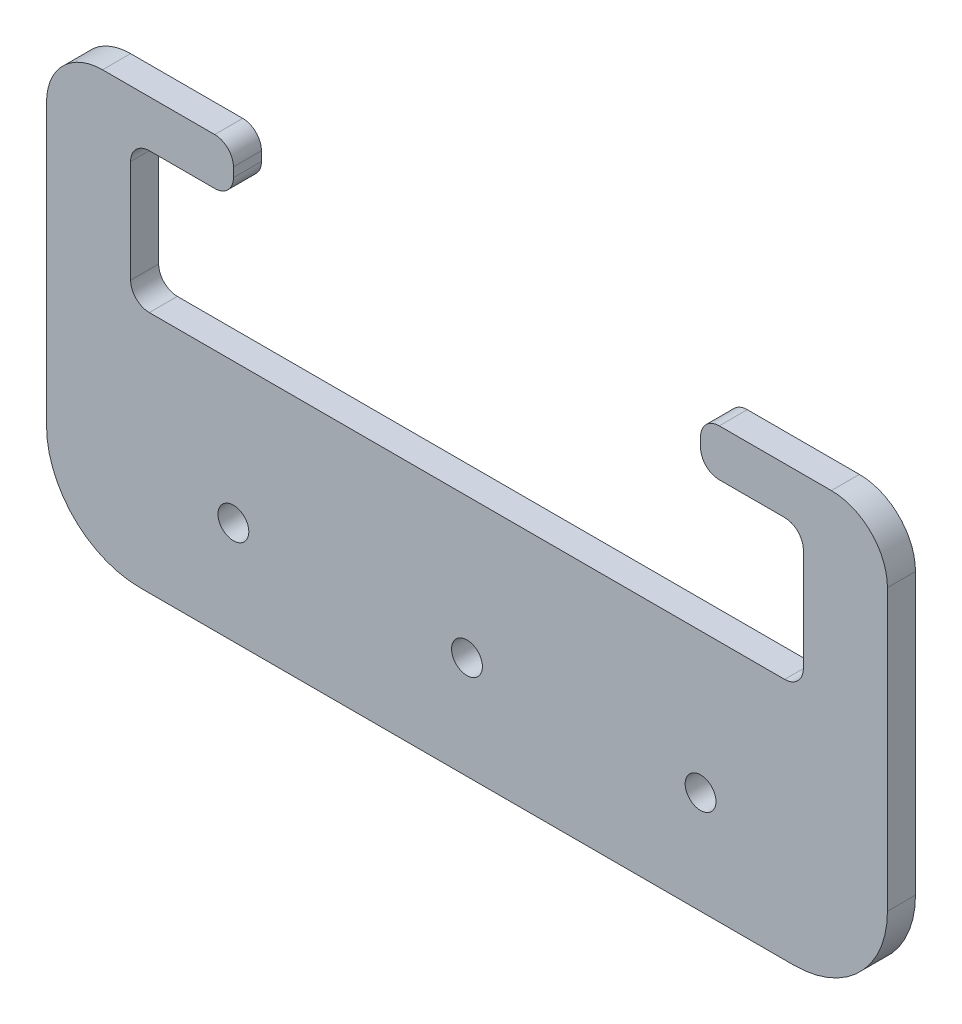
ISO-10303-21;
HEADER;
FILE_DESCRIPTION(('STEP AP214'),'2;1');
FILE_NAME('part.step','',(''),(''),'','','');
FILE_SCHEMA(('AUTOMOTIVE_DESIGN { 1 0 10303 214 1 1 1 1 }'));
ENDSEC;
DATA;
#1=APPLICATION_CONTEXT('core data for automotive mechanical design processes');
#2=APPLICATION_PROTOCOL_DEFINITION('international standard','automotive_design',2000,#1);
#3=PRODUCT_CONTEXT('',#1,'mechanical');
#4=PRODUCT('Part','Part','',(#3));
#5=PRODUCT_RELATED_PRODUCT_CATEGORY('part','',(#4));
#6=PRODUCT_DEFINITION_FORMATION('','',#4);
#7=PRODUCT_DEFINITION_CONTEXT('part definition',#1,'design');
#8=PRODUCT_DEFINITION('design','',#6,#7);
#9=PRODUCT_DEFINITION_SHAPE('','',#8);
#10=(LENGTH_UNIT() NAMED_UNIT(*) SI_UNIT(.MILLI.,.METRE.));
#11=(NAMED_UNIT(*) PLANE_ANGLE_UNIT() SI_UNIT($,.RADIAN.));
#12=(NAMED_UNIT(*) SI_UNIT($,.STERADIAN.) SOLID_ANGLE_UNIT());
#13=UNCERTAINTY_MEASURE_WITH_UNIT(LENGTH_MEASURE(1.E-05),#10,'distance_accuracy_value','');
#14=(GEOMETRIC_REPRESENTATION_CONTEXT(3) GLOBAL_UNCERTAINTY_ASSIGNED_CONTEXT((#13)) GLOBAL_UNIT_ASSIGNED_CONTEXT((#10,
#11,#12)) REPRESENTATION_CONTEXT('',''));
#15=CARTESIAN_POINT('',(0.,0.,0.));
#16=DIRECTION('',(0.,0.,1.));
#17=DIRECTION('',(1.,0.,0.));
#18=AXIS2_PLACEMENT_3D('',#15,#16,#17);
#19=CARTESIAN_POINT('',(45.,25.,3.));
#20=DIRECTION('',(-1.,0.,0.));
#21=DIRECTION('',(0.,0.,1.));
#22=AXIS2_PLACEMENT_3D('',#19,#20,#21);
#23=PLANE('',#22);
#24=DIRECTION('',(0.,1.,0.));
#25=VECTOR('',#24,1.);
#26=CARTESIAN_POINT('',(45.,25.,3.));
#27=LINE('',#26,#25);
#28=CARTESIAN_POINT('',(45.,-11.,3.));
#29=VERTEX_POINT('',#28);
#30=CARTESIAN_POINT('',(45.,19.,3.));
#31=VERTEX_POINT('',#30);
#32=EDGE_CURVE('E257',#29,#31,#27,.T.);
#33=ORIENTED_EDGE('',*,*,#32,.F.);
#34=DIRECTION('',(0.,0.,1.));
#35=VECTOR('',#34,1.);
#36=CARTESIAN_POINT('',(45.,-11.,3.));
#37=LINE('',#36,#35);
#38=CARTESIAN_POINT('',(45.,-11.,0.));
#39=VERTEX_POINT('',#38);
#40=EDGE_CURVE('E64',#29,#39,#37,.F.);
#41=ORIENTED_EDGE('',*,*,#40,.T.);
#42=DIRECTION('',(0.,1.,0.));
#43=VECTOR('',#42,1.);
#44=CARTESIAN_POINT('',(45.,25.,0.));
#45=LINE('',#44,#43);
#46=CARTESIAN_POINT('',(45.,19.,0.));
#47=VERTEX_POINT('',#46);
#48=EDGE_CURVE('E228',#39,#47,#45,.T.);
#49=ORIENTED_EDGE('',*,*,#48,.T.);
#50=DIRECTION('',(0.,0.,-1.));
#51=VECTOR('',#50,1.);
#52=CARTESIAN_POINT('',(45.,19.,3.));
#53=LINE('',#52,#51);
#54=EDGE_CURVE('E210',#47,#31,#53,.F.);
#55=ORIENTED_EDGE('',*,*,#54,.T.);
#56=EDGE_LOOP('',(#33,#41,#49,#55));
#57=FACE_BOUND('',#56,.T.);
#58=ADVANCED_FACE('F41',(#57),#23,.F.);
#59=CARTESIAN_POINT('',(25.,25.,3.));
#60=DIRECTION('',(0.,-1.,0.));
#61=DIRECTION('',(0.,0.,-1.));
#62=AXIS2_PLACEMENT_3D('',#59,#60,#61);
#63=PLANE('',#62);
#64=DIRECTION('',(-1.,0.,0.));
#65=VECTOR('',#64,1.);
#66=CARTESIAN_POINT('',(25.,25.,0.));
#67=LINE('',#66,#65);
#68=CARTESIAN_POINT('',(39.,25.,0.));
#69=VERTEX_POINT('',#68);
#70=CARTESIAN_POINT('',(27.,25.,0.));
#71=VERTEX_POINT('',#70);
#72=EDGE_CURVE('E218',#69,#71,#67,.T.);
#73=ORIENTED_EDGE('',*,*,#72,.T.);
#74=DIRECTION('',(0.,0.,-1.));
#75=VECTOR('',#74,1.);
#76=CARTESIAN_POINT('',(27.,25.,3.));
#77=LINE('',#76,#75);
#78=CARTESIAN_POINT('',(27.,25.,3.));
#79=VERTEX_POINT('',#78);
#80=EDGE_CURVE('E325',#71,#79,#77,.F.);
#81=ORIENTED_EDGE('',*,*,#80,.T.);
#82=DIRECTION('',(-1.,0.,0.));
#83=VECTOR('',#82,1.);
#84=CARTESIAN_POINT('',(25.,25.,3.));
#85=LINE('',#84,#83);
#86=CARTESIAN_POINT('',(39.,25.,3.));
#87=VERTEX_POINT('',#86);
#88=EDGE_CURVE('E221',#87,#79,#85,.T.);
#89=ORIENTED_EDGE('',*,*,#88,.F.);
#90=DIRECTION('',(0.,0.,-1.));
#91=VECTOR('',#90,1.);
#92=CARTESIAN_POINT('',(39.,25.,3.));
#93=LINE('',#92,#91);
#94=EDGE_CURVE('E208',#87,#69,#93,.T.);
#95=ORIENTED_EDGE('',*,*,#94,.T.);
#96=EDGE_LOOP('',(#73,#81,#89,#95));
#97=FACE_BOUND('',#96,.T.);
#98=ADVANCED_FACE('F217',(#97),#63,.F.);
#99=CARTESIAN_POINT('',(25.,25.,3.));
#100=DIRECTION('',(1.,0.,0.));
#101=DIRECTION('',(0.,0.,-1.));
#102=AXIS2_PLACEMENT_3D('',#99,#100,#101);
#103=PLANE('',#102);
#104=DIRECTION('',(0.,-1.,0.));
#105=VECTOR('',#104,1.);
#106=CARTESIAN_POINT('',(25.,25.,0.));
#107=LINE('',#106,#105);
#108=CARTESIAN_POINT('',(25.,23.,0.));
#109=VERTEX_POINT('',#108);
#110=CARTESIAN_POINT('',(25.,22.,0.));
#111=VERTEX_POINT('',#110);
#112=EDGE_CURVE('E227',#109,#111,#107,.T.);
#113=ORIENTED_EDGE('',*,*,#112,.T.);
#114=DIRECTION('',(0.,0.,-1.));
#115=VECTOR('',#114,1.);
#116=CARTESIAN_POINT('',(25.,22.,3.));
#117=LINE('',#116,#115);
#118=CARTESIAN_POINT('',(25.,22.,3.));
#119=VERTEX_POINT('',#118);
#120=EDGE_CURVE('E323',#111,#119,#117,.F.);
#121=ORIENTED_EDGE('',*,*,#120,.T.);
#122=DIRECTION('',(0.,-1.,0.));
#123=VECTOR('',#122,1.);
#124=CARTESIAN_POINT('',(25.,25.,3.));
#125=LINE('',#124,#123);
#126=CARTESIAN_POINT('',(25.,23.,3.));
#127=VERTEX_POINT('',#126);
#128=EDGE_CURVE('E381',#127,#119,#125,.T.);
#129=ORIENTED_EDGE('',*,*,#128,.F.);
#130=DIRECTION('',(0.,0.,-1.));
#131=VECTOR('',#130,1.);
#132=CARTESIAN_POINT('',(25.,23.,3.));
#133=LINE('',#132,#131);
#134=EDGE_CURVE('E320',#127,#109,#133,.T.);
#135=ORIENTED_EDGE('',*,*,#134,.T.);
#136=EDGE_LOOP('',(#113,#121,#129,#135));
#137=FACE_BOUND('',#136,.T.);
#138=ADVANCED_FACE('F483',(#137),#103,.F.);
#139=CARTESIAN_POINT('',(36.,20.,3.));
#140=DIRECTION('',(0.,1.,0.));
#141=DIRECTION('',(-1.,0.,0.));
#142=AXIS2_PLACEMENT_3D('',#139,#140,#141);
#143=PLANE('',#142);
#144=DIRECTION('',(1.,0.,0.));
#145=VECTOR('',#144,1.);
#146=CARTESIAN_POINT('',(36.,20.,0.));
#147=LINE('',#146,#145);
#148=CARTESIAN_POINT('',(27.,20.,0.));
#149=VERTEX_POINT('',#148);
#150=CARTESIAN_POINT('',(34.,20.,0.));
#151=VERTEX_POINT('',#150);
#152=EDGE_CURVE('E231',#149,#151,#147,.T.);
#153=ORIENTED_EDGE('',*,*,#152,.T.);
#154=DIRECTION('',(0.,0.,-1.));
#155=VECTOR('',#154,1.);
#156=CARTESIAN_POINT('',(34.,20.,3.));
#157=LINE('',#156,#155);
#158=CARTESIAN_POINT('',(34.,20.,3.));
#159=VERTEX_POINT('',#158);
#160=EDGE_CURVE('E280',#151,#159,#157,.F.);
#161=ORIENTED_EDGE('',*,*,#160,.T.);
#162=DIRECTION('',(1.,0.,0.));
#163=VECTOR('',#162,1.);
#164=CARTESIAN_POINT('',(36.,20.,3.));
#165=LINE('',#164,#163);
#166=CARTESIAN_POINT('',(27.,20.,3.));
#167=VERTEX_POINT('',#166);
#168=EDGE_CURVE('E388',#167,#159,#165,.T.);
#169=ORIENTED_EDGE('',*,*,#168,.F.);
#170=DIRECTION('',(0.,0.,-1.));
#171=VECTOR('',#170,1.);
#172=CARTESIAN_POINT('',(27.,20.,3.));
#173=LINE('',#172,#171);
#174=EDGE_CURVE('E277',#167,#149,#173,.T.);
#175=ORIENTED_EDGE('',*,*,#174,.T.);
#176=EDGE_LOOP('',(#153,#161,#169,#175));
#177=FACE_BOUND('',#176,.T.);
#178=ADVANCED_FACE('F475',(#177),#143,.F.);
#179=CARTESIAN_POINT('',(36.,20.,3.));
#180=DIRECTION('',(1.,0.,0.));
#181=DIRECTION('',(0.,0.,-1.));
#182=AXIS2_PLACEMENT_3D('',#179,#180,#181);
#183=PLANE('',#182);
#184=DIRECTION('',(0.,-1.,0.));
#185=VECTOR('',#184,1.);
#186=CARTESIAN_POINT('',(36.,20.,3.));
#187=LINE('',#186,#185);
#188=CARTESIAN_POINT('',(36.,18.,3.));
#189=VERTEX_POINT('',#188);
#190=CARTESIAN_POINT('',(36.,7.00000000000002,3.));
#191=VERTEX_POINT('',#190);
#192=EDGE_CURVE('E391',#189,#191,#187,.T.);
#193=ORIENTED_EDGE('',*,*,#192,.F.);
#194=DIRECTION('',(0.,0.,-1.));
#195=VECTOR('',#194,1.);
#196=CARTESIAN_POINT('',(36.,18.,0.));
#197=LINE('',#196,#195);
#198=CARTESIAN_POINT('',(36.,18.,0.));
#199=VERTEX_POINT('',#198);
#200=EDGE_CURVE('E274',#189,#199,#197,.T.);
#201=ORIENTED_EDGE('',*,*,#200,.T.);
#202=DIRECTION('',(0.,-1.,0.));
#203=VECTOR('',#202,1.);
#204=CARTESIAN_POINT('',(36.,20.,0.));
#205=LINE('',#204,#203);
#206=CARTESIAN_POINT('',(36.,7.00000000000002,0.));
#207=VERTEX_POINT('',#206);
#208=EDGE_CURVE('E239',#199,#207,#205,.T.);
#209=ORIENTED_EDGE('',*,*,#208,.T.);
#210=DIRECTION('',(0.,0.,-1.));
#211=VECTOR('',#210,1.);
#212=CARTESIAN_POINT('',(36.,7.00000000000002,3.));
#213=LINE('',#212,#211);
#214=EDGE_CURVE('E272',#207,#191,#213,.F.);
#215=ORIENTED_EDGE('',*,*,#214,.T.);
#216=EDGE_LOOP('',(#193,#201,#209,#215));
#217=FACE_BOUND('',#216,.T.);
#218=ADVANCED_FACE('F467',(#217),#183,.F.);
#219=CARTESIAN_POINT('',(36.,5.00000000000002,3.));
#220=DIRECTION('',(0.,-1.,0.));
#221=DIRECTION('',(1.,0.,0.));
#222=AXIS2_PLACEMENT_3D('',#219,#220,#221);
#223=PLANE('',#222);
#224=DIRECTION('',(-1.,0.,0.));
#225=VECTOR('',#224,1.);
#226=CARTESIAN_POINT('',(36.,5.00000000000002,3.));
#227=LINE('',#226,#225);
#228=CARTESIAN_POINT('',(34.,5.00000000000002,3.));
#229=VERTEX_POINT('',#228);
#230=CARTESIAN_POINT('',(-34.,5.00000000000001,3.));
#231=VERTEX_POINT('',#230);
#232=EDGE_CURVE('E394',#229,#231,#227,.T.);
#233=ORIENTED_EDGE('',*,*,#232,.F.);
#234=DIRECTION('',(0.,0.,-1.));
#235=VECTOR('',#234,1.);
#236=CARTESIAN_POINT('',(34.,5.00000000000002,0.));
#237=LINE('',#236,#235);
#238=CARTESIAN_POINT('',(34.,5.00000000000002,0.));
#239=VERTEX_POINT('',#238);
#240=EDGE_CURVE('E284',#229,#239,#237,.T.);
#241=ORIENTED_EDGE('',*,*,#240,.T.);
#242=DIRECTION('',(-1.,0.,0.));
#243=VECTOR('',#242,1.);
#244=CARTESIAN_POINT('',(36.,5.00000000000002,0.));
#245=LINE('',#244,#243);
#246=CARTESIAN_POINT('',(-34.,5.00000000000001,0.));
#247=VERTEX_POINT('',#246);
#248=EDGE_CURVE('E242',#239,#247,#245,.T.);
#249=ORIENTED_EDGE('',*,*,#248,.T.);
#250=DIRECTION('',(0.,0.,-1.));
#251=VECTOR('',#250,1.);
#252=CARTESIAN_POINT('',(-34.,5.00000000000001,3.));
#253=LINE('',#252,#251);
#254=EDGE_CURVE('E282',#247,#231,#253,.F.);
#255=ORIENTED_EDGE('',*,*,#254,.T.);
#256=EDGE_LOOP('',(#233,#241,#249,#255));
#257=FACE_BOUND('',#256,.T.);
#258=ADVANCED_FACE('F458',(#257),#223,.F.);
#259=CARTESIAN_POINT('',(-36.,20.,3.));
#260=DIRECTION('',(-1.,0.,0.));
#261=DIRECTION('',(0.,0.,1.));
#262=AXIS2_PLACEMENT_3D('',#259,#260,#261);
#263=PLANE('',#262);
#264=DIRECTION('',(0.,1.,0.));
#265=VECTOR('',#264,1.);
#266=CARTESIAN_POINT('',(-36.,20.,3.));
#267=LINE('',#266,#265);
#268=CARTESIAN_POINT('',(-36.,7.00000000000001,3.));
#269=VERTEX_POINT('',#268);
#270=CARTESIAN_POINT('',(-36.,18.,3.));
#271=VERTEX_POINT('',#270);
#272=EDGE_CURVE('E397',#269,#271,#267,.T.);
#273=ORIENTED_EDGE('',*,*,#272,.F.);
#274=DIRECTION('',(0.,0.,-1.));
#275=VECTOR('',#274,1.);
#276=CARTESIAN_POINT('',(-36.,7.00000000000001,0.));
#277=LINE('',#276,#275);
#278=CARTESIAN_POINT('',(-36.,7.00000000000001,0.));
#279=VERTEX_POINT('',#278);
#280=EDGE_CURVE('E289',#269,#279,#277,.T.);
#281=ORIENTED_EDGE('',*,*,#280,.T.);
#282=DIRECTION('',(0.,1.,0.));
#283=VECTOR('',#282,1.);
#284=CARTESIAN_POINT('',(-36.,20.,0.));
#285=LINE('',#284,#283);
#286=CARTESIAN_POINT('',(-36.,18.,0.));
#287=VERTEX_POINT('',#286);
#288=EDGE_CURVE('E245',#279,#287,#285,.T.);
#289=ORIENTED_EDGE('',*,*,#288,.T.);
#290=DIRECTION('',(0.,0.,-1.));
#291=VECTOR('',#290,1.);
#292=CARTESIAN_POINT('',(-36.,18.,3.));
#293=LINE('',#292,#291);
#294=EDGE_CURVE('E287',#287,#271,#293,.F.);
#295=ORIENTED_EDGE('',*,*,#294,.T.);
#296=EDGE_LOOP('',(#273,#281,#289,#295));
#297=FACE_BOUND('',#296,.T.);
#298=ADVANCED_FACE('F449',(#297),#263,.F.);
#299=CARTESIAN_POINT('',(-25.,20.,3.));
#300=DIRECTION('',(0.,1.,0.));
#301=DIRECTION('',(0.,0.,1.));
#302=AXIS2_PLACEMENT_3D('',#299,#300,#301);
#303=PLANE('',#302);
#304=DIRECTION('',(1.,0.,0.));
#305=VECTOR('',#304,1.);
#306=CARTESIAN_POINT('',(-25.,20.,3.));
#307=LINE('',#306,#305);
#308=CARTESIAN_POINT('',(-34.,20.,3.));
#309=VERTEX_POINT('',#308);
#310=CARTESIAN_POINT('',(-27.,20.,3.));
#311=VERTEX_POINT('',#310);
#312=EDGE_CURVE('E400',#309,#311,#307,.T.);
#313=ORIENTED_EDGE('',*,*,#312,.F.);
#314=DIRECTION('',(0.,0.,-1.));
#315=VECTOR('',#314,1.);
#316=CARTESIAN_POINT('',(-34.,20.,0.));
#317=LINE('',#316,#315);
#318=CARTESIAN_POINT('',(-34.,20.,0.));
#319=VERTEX_POINT('',#318);
#320=EDGE_CURVE('E294',#309,#319,#317,.T.);
#321=ORIENTED_EDGE('',*,*,#320,.T.);
#322=DIRECTION('',(1.,0.,0.));
#323=VECTOR('',#322,1.);
#324=CARTESIAN_POINT('',(-25.,20.,0.));
#325=LINE('',#324,#323);
#326=CARTESIAN_POINT('',(-27.,20.,0.));
#327=VERTEX_POINT('',#326);
#328=EDGE_CURVE('E248',#319,#327,#325,.T.);
#329=ORIENTED_EDGE('',*,*,#328,.T.);
#330=DIRECTION('',(0.,0.,-1.));
#331=VECTOR('',#330,1.);
#332=CARTESIAN_POINT('',(-27.,20.,3.));
#333=LINE('',#332,#331);
#334=EDGE_CURVE('E292',#327,#311,#333,.F.);
#335=ORIENTED_EDGE('',*,*,#334,.T.);
#336=EDGE_LOOP('',(#313,#321,#329,#335));
#337=FACE_BOUND('',#336,.T.);
#338=ADVANCED_FACE('F440',(#337),#303,.F.);
#339=CARTESIAN_POINT('',(-25.,25.,3.));
#340=DIRECTION('',(-1.,0.,0.));
#341=DIRECTION('',(0.,0.,1.));
#342=AXIS2_PLACEMENT_3D('',#339,#340,#341);
#343=PLANE('',#342);
#344=DIRECTION('',(0.,1.,0.));
#345=VECTOR('',#344,1.);
#346=CARTESIAN_POINT('',(-25.,25.,3.));
#347=LINE('',#346,#345);
#348=CARTESIAN_POINT('',(-25.,22.,3.));
#349=VERTEX_POINT('',#348);
#350=CARTESIAN_POINT('',(-25.,23.,3.));
#351=VERTEX_POINT('',#350);
#352=EDGE_CURVE('E403',#349,#351,#347,.T.);
#353=ORIENTED_EDGE('',*,*,#352,.F.);
#354=DIRECTION('',(0.,0.,-1.));
#355=VECTOR('',#354,1.);
#356=CARTESIAN_POINT('',(-25.,22.,3.));
#357=LINE('',#356,#355);
#358=CARTESIAN_POINT('',(-25.,22.,0.));
#359=VERTEX_POINT('',#358);
#360=EDGE_CURVE('E299',#349,#359,#357,.T.);
#361=ORIENTED_EDGE('',*,*,#360,.T.);
#362=DIRECTION('',(0.,1.,0.));
#363=VECTOR('',#362,1.);
#364=CARTESIAN_POINT('',(-25.,25.,0.));
#365=LINE('',#364,#363);
#366=CARTESIAN_POINT('',(-25.,23.,0.));
#367=VERTEX_POINT('',#366);
#368=EDGE_CURVE('E251',#359,#367,#365,.T.);
#369=ORIENTED_EDGE('',*,*,#368,.T.);
#370=DIRECTION('',(0.,0.,-1.));
#371=VECTOR('',#370,1.);
#372=CARTESIAN_POINT('',(-25.,23.,3.));
#373=LINE('',#372,#371);
#374=EDGE_CURVE('E297',#367,#351,#373,.F.);
#375=ORIENTED_EDGE('',*,*,#374,.T.);
#376=EDGE_LOOP('',(#353,#361,#369,#375));
#377=FACE_BOUND('',#376,.T.);
#378=ADVANCED_FACE('F431',(#377),#343,.F.);
#379=CARTESIAN_POINT('',(-45.,25.,3.));
#380=DIRECTION('',(0.,-1.,0.));
#381=DIRECTION('',(0.,0.,-1.));
#382=AXIS2_PLACEMENT_3D('',#379,#380,#381);
#383=PLANE('',#382);
#384=DIRECTION('',(-1.,0.,0.));
#385=VECTOR('',#384,1.);
#386=CARTESIAN_POINT('',(-45.,25.,3.));
#387=LINE('',#386,#385);
#388=CARTESIAN_POINT('',(-27.,25.,3.));
#389=VERTEX_POINT('',#388);
#390=CARTESIAN_POINT('',(-39.,25.,3.));
#391=VERTEX_POINT('',#390);
#392=EDGE_CURVE('E406',#389,#391,#387,.T.);
#393=ORIENTED_EDGE('',*,*,#392,.F.);
#394=DIRECTION('',(0.,0.,-1.));
#395=VECTOR('',#394,1.);
#396=CARTESIAN_POINT('',(-27.,25.,3.));
#397=LINE('',#396,#395);
#398=CARTESIAN_POINT('',(-27.,25.,0.));
#399=VERTEX_POINT('',#398);
#400=EDGE_CURVE('E317',#389,#399,#397,.T.);
#401=ORIENTED_EDGE('',*,*,#400,.T.);
#402=DIRECTION('',(-1.,0.,0.));
#403=VECTOR('',#402,1.);
#404=CARTESIAN_POINT('',(-45.,25.,0.));
#405=LINE('',#404,#403);
#406=CARTESIAN_POINT('',(-39.,25.,0.));
#407=VERTEX_POINT('',#406);
#408=EDGE_CURVE('E254',#399,#407,#405,.T.);
#409=ORIENTED_EDGE('',*,*,#408,.T.);
#410=DIRECTION('',(0.,0.,-1.));
#411=VECTOR('',#410,1.);
#412=CARTESIAN_POINT('',(-39.,25.,3.));
#413=LINE('',#412,#411);
#414=EDGE_CURVE('E269',#407,#391,#413,.F.);
#415=ORIENTED_EDGE('',*,*,#414,.T.);
#416=EDGE_LOOP('',(#393,#401,#409,#415));
#417=FACE_BOUND('',#416,.T.);
#418=ADVANCED_FACE('F422',(#417),#383,.F.);
#419=CARTESIAN_POINT('',(-45.,25.,3.));
#420=DIRECTION('',(1.,0.,0.));
#421=DIRECTION('',(0.,1.,0.));
#422=AXIS2_PLACEMENT_3D('',#419,#420,#421);
#423=PLANE('',#422);
#424=DIRECTION('',(0.,-1.,0.));
#425=VECTOR('',#424,1.);
#426=CARTESIAN_POINT('',(-45.,25.,0.));
#427=LINE('',#426,#425);
#428=CARTESIAN_POINT('',(-45.,19.,0.));
#429=VERTEX_POINT('',#428);
#430=CARTESIAN_POINT('',(-45.,-11.,0.));
#431=VERTEX_POINT('',#430);
#432=EDGE_CURVE('E256',#429,#431,#427,.T.);
#433=ORIENTED_EDGE('',*,*,#432,.T.);
#434=DIRECTION('',(0.,0.,-1.));
#435=VECTOR('',#434,1.);
#436=CARTESIAN_POINT('',(-45.,-11.,3.));
#437=LINE('',#436,#435);
#438=CARTESIAN_POINT('',(-45.,-11.,3.));
#439=VERTEX_POINT('',#438);
#440=EDGE_CURVE('E11',#431,#439,#437,.F.);
#441=ORIENTED_EDGE('',*,*,#440,.T.);
#442=DIRECTION('',(0.,-1.,0.));
#443=VECTOR('',#442,1.);
#444=CARTESIAN_POINT('',(-45.,25.,3.));
#445=LINE('',#444,#443);
#446=CARTESIAN_POINT('',(-45.,19.,3.));
#447=VERTEX_POINT('',#446);
#448=EDGE_CURVE('E222',#447,#439,#445,.T.);
#449=ORIENTED_EDGE('',*,*,#448,.F.);
#450=DIRECTION('',(0.,0.,-1.));
#451=VECTOR('',#450,1.);
#452=CARTESIAN_POINT('',(-45.,19.,3.));
#453=LINE('',#452,#451);
#454=EDGE_CURVE('E266',#447,#429,#453,.T.);
#455=ORIENTED_EDGE('',*,*,#454,.T.);
#456=EDGE_LOOP('',(#433,#441,#449,#455));
#457=FACE_BOUND('',#456,.T.);
#458=ADVANCED_FACE('F415',(#457),#423,.F.);
#459=CARTESIAN_POINT('',(0.,0.,3.));
#460=DIRECTION('',(0.,0.,1.));
#461=DIRECTION('',(1.,0.,0.));
#462=AXIS2_PLACEMENT_3D('',#459,#460,#461);
#463=PLANE('',#462);
#464=DIRECTION('',(-1.,0.,0.));
#465=VECTOR('',#464,1.);
#466=CARTESIAN_POINT('',(-45.,-21.,3.));
#467=LINE('',#466,#465);
#468=CARTESIAN_POINT('',(35.,-21.,3.));
#469=VERTEX_POINT('',#468);
#470=CARTESIAN_POINT('',(-35.,-21.,3.));
#471=VERTEX_POINT('',#470);
#472=EDGE_CURVE('E374',#469,#471,#467,.T.);
#473=ORIENTED_EDGE('',*,*,#472,.F.);
#474=CARTESIAN_POINT('',(35.,-11.,3.));
#475=DIRECTION('',(0.,0.,1.));
#476=DIRECTION('',(1.,0.,0.));
#477=AXIS2_PLACEMENT_3D('',#474,#475,#476);
#478=CIRCLE('',#477,10.);
#479=EDGE_CURVE('E360',#469,#29,#478,.T.);
#480=ORIENTED_EDGE('',*,*,#479,.T.);
#481=ORIENTED_EDGE('',*,*,#32,.T.);
#482=CARTESIAN_POINT('',(39.,19.,3.));
#483=DIRECTION('',(0.,0.,1.));
#484=DIRECTION('',(1.,0.,0.));
#485=AXIS2_PLACEMENT_3D('',#482,#483,#484);
#486=CIRCLE('',#485,6.);
#487=EDGE_CURVE('E264',#31,#87,#486,.T.);
#488=ORIENTED_EDGE('',*,*,#487,.T.);
#489=ORIENTED_EDGE('',*,*,#88,.T.);
#490=CARTESIAN_POINT('',(27.,23.,3.));
#491=DIRECTION('',(0.,0.,1.));
#492=DIRECTION('',(1.,0.,0.));
#493=AXIS2_PLACEMENT_3D('',#490,#491,#492);
#494=CIRCLE('',#493,2.);
#495=EDGE_CURVE('E309',#79,#127,#494,.T.);
#496=ORIENTED_EDGE('',*,*,#495,.T.);
#497=ORIENTED_EDGE('',*,*,#128,.T.);
#498=CARTESIAN_POINT('',(27.,22.,3.));
#499=DIRECTION('',(0.,0.,1.));
#500=DIRECTION('',(1.,0.,0.));
#501=AXIS2_PLACEMENT_3D('',#498,#499,#500);
#502=CIRCLE('',#501,2.);
#503=EDGE_CURVE('E311',#119,#167,#502,.T.);
#504=ORIENTED_EDGE('',*,*,#503,.T.);
#505=ORIENTED_EDGE('',*,*,#168,.T.);
#506=CARTESIAN_POINT('',(34.,18.,3.));
#507=DIRECTION('',(0.,0.,1.));
#508=DIRECTION('',(1.,0.,0.));
#509=AXIS2_PLACEMENT_3D('',#506,#507,#508);
#510=CIRCLE('',#509,2.);
#511=EDGE_CURVE('E329',#159,#189,#510,.F.);
#512=ORIENTED_EDGE('',*,*,#511,.T.);
#513=ORIENTED_EDGE('',*,*,#192,.T.);
#514=CARTESIAN_POINT('',(34.,7.00000000000002,3.));
#515=DIRECTION('',(0.,0.,1.));
#516=DIRECTION('',(1.,0.,0.));
#517=AXIS2_PLACEMENT_3D('',#514,#515,#516);
#518=CIRCLE('',#517,2.);
#519=EDGE_CURVE('E333',#191,#229,#518,.F.);
#520=ORIENTED_EDGE('',*,*,#519,.T.);
#521=ORIENTED_EDGE('',*,*,#232,.T.);
#522=CARTESIAN_POINT('',(-34.,7.00000000000001,3.));
#523=DIRECTION('',(0.,0.,1.));
#524=DIRECTION('',(1.,0.,0.));
#525=AXIS2_PLACEMENT_3D('',#522,#523,#524);
#526=CIRCLE('',#525,2.);
#527=EDGE_CURVE('E337',#231,#269,#526,.F.);
#528=ORIENTED_EDGE('',*,*,#527,.T.);
#529=ORIENTED_EDGE('',*,*,#272,.T.);
#530=CARTESIAN_POINT('',(-34.,18.,3.));
#531=DIRECTION('',(0.,0.,1.));
#532=DIRECTION('',(1.,0.,0.));
#533=AXIS2_PLACEMENT_3D('',#530,#531,#532);
#534=CIRCLE('',#533,2.);
#535=EDGE_CURVE('E341',#271,#309,#534,.F.);
#536=ORIENTED_EDGE('',*,*,#535,.T.);
#537=ORIENTED_EDGE('',*,*,#312,.T.);
#538=CARTESIAN_POINT('',(-27.,22.,3.));
#539=DIRECTION('',(0.,0.,1.));
#540=DIRECTION('',(1.,0.,0.));
#541=AXIS2_PLACEMENT_3D('',#538,#539,#540);
#542=CIRCLE('',#541,2.);
#543=EDGE_CURVE('E315',#311,#349,#542,.T.);
#544=ORIENTED_EDGE('',*,*,#543,.T.);
#545=ORIENTED_EDGE('',*,*,#352,.T.);
#546=CARTESIAN_POINT('',(-27.,23.,3.));
#547=DIRECTION('',(0.,0.,1.));
#548=DIRECTION('',(1.,0.,0.));
#549=AXIS2_PLACEMENT_3D('',#546,#547,#548);
#550=CIRCLE('',#549,2.);
#551=EDGE_CURVE('E313',#351,#389,#550,.T.);
#552=ORIENTED_EDGE('',*,*,#551,.T.);
#553=ORIENTED_EDGE('',*,*,#392,.T.);
#554=CARTESIAN_POINT('',(-39.,19.,3.));
#555=DIRECTION('',(0.,0.,1.));
#556=DIRECTION('',(1.,0.,0.));
#557=AXIS2_PLACEMENT_3D('',#554,#555,#556);
#558=CIRCLE('',#557,6.);
#559=EDGE_CURVE('E262',#391,#447,#558,.T.);
#560=ORIENTED_EDGE('',*,*,#559,.T.);
#561=ORIENTED_EDGE('',*,*,#448,.T.);
#562=CARTESIAN_POINT('',(-35.,-11.,3.));
#563=DIRECTION('',(0.,0.,1.));
#564=DIRECTION('',(1.,0.,0.));
#565=AXIS2_PLACEMENT_3D('',#562,#563,#564);
#566=CIRCLE('',#565,10.);
#567=EDGE_CURVE('E358',#439,#471,#566,.T.);
#568=ORIENTED_EDGE('',*,*,#567,.T.);
#569=EDGE_LOOP('',(#473,#480,#481,#488,#489,#496,#497,#504,#505,#512,#513,#520,#521,#528,#529,
#536,#537,#544,#545,#552,#553,#560,#561,#568));
#570=FACE_BOUND('',#569,.T.);
#571=CARTESIAN_POINT('',(-25.,-10.,3.));
#572=DIRECTION('',(0.,0.,1.));
#573=DIRECTION('',(1.,0.,0.));
#574=AXIS2_PLACEMENT_3D('',#571,#572,#573);
#575=CIRCLE('',#574,1.65);
#576=CARTESIAN_POINT('',(-23.35,-10.,3.));
#577=VERTEX_POINT('',#576);
#578=EDGE_CURVE('E348',#577,#577,#575,.T.);
#579=ORIENTED_EDGE('',*,*,#578,.F.);
#580=EDGE_LOOP('',(#579));
#581=FACE_BOUND('',#580,.T.);
#582=CARTESIAN_POINT('',(25.,-10.,3.));
#583=DIRECTION('',(0.,0.,1.));
#584=DIRECTION('',(1.,0.,0.));
#585=AXIS2_PLACEMENT_3D('',#582,#583,#584);
#586=CIRCLE('',#585,1.65);
#587=CARTESIAN_POINT('',(26.65,-10.,3.));
#588=VERTEX_POINT('',#587);
#589=EDGE_CURVE('E736',#588,#588,#586,.T.);
#590=ORIENTED_EDGE('',*,*,#589,.F.);
#591=EDGE_LOOP('',(#590));
#592=FACE_BOUND('',#591,.T.);
#593=CARTESIAN_POINT('',(0.,-10.,3.));
#594=DIRECTION('',(0.,0.,1.));
#595=DIRECTION('',(1.,0.,0.));
#596=AXIS2_PLACEMENT_3D('',#593,#594,#595);
#597=CIRCLE('',#596,1.65);
#598=CARTESIAN_POINT('',(1.65,-10.,3.));
#599=VERTEX_POINT('',#598);
#600=EDGE_CURVE('E373',#599,#599,#597,.T.);
#601=ORIENTED_EDGE('',*,*,#600,.F.);
#602=EDGE_LOOP('',(#601));
#603=FACE_BOUND('',#602,.T.);
#604=ADVANCED_FACE('F378',(#570,#581,#592,#603),#463,.T.);
#605=CARTESIAN_POINT('',(0.,0.,0.));
#606=DIRECTION('',(0.,0.,1.));
#607=DIRECTION('',(1.,0.,0.));
#608=AXIS2_PLACEMENT_3D('',#605,#606,#607);
#609=PLANE('',#608);
#610=CARTESIAN_POINT('',(-25.,-10.,0.));
#611=DIRECTION('',(0.,0.,1.));
#612=DIRECTION('',(1.,0.,0.));
#613=AXIS2_PLACEMENT_3D('',#610,#611,#612);
#614=CIRCLE('',#613,1.65);
#615=CARTESIAN_POINT('',(-23.35,-10.,0.));
#616=VERTEX_POINT('',#615);
#617=EDGE_CURVE('E233',#616,#616,#614,.T.);
#618=ORIENTED_EDGE('',*,*,#617,.T.);
#619=EDGE_LOOP('',(#618));
#620=FACE_BOUND('',#619,.T.);
#621=CARTESIAN_POINT('',(25.,-10.,0.));
#622=DIRECTION('',(0.,0.,1.));
#623=DIRECTION('',(1.,0.,0.));
#624=AXIS2_PLACEMENT_3D('',#621,#622,#623);
#625=CIRCLE('',#624,1.65);
#626=CARTESIAN_POINT('',(26.65,-10.,0.));
#627=VERTEX_POINT('',#626);
#628=EDGE_CURVE('E347',#627,#627,#625,.T.);
#629=ORIENTED_EDGE('',*,*,#628,.T.);
#630=EDGE_LOOP('',(#629));
#631=FACE_BOUND('',#630,.T.);
#632=CARTESIAN_POINT('',(0.,-10.,0.));
#633=DIRECTION('',(0.,0.,1.));
#634=DIRECTION('',(1.,0.,0.));
#635=AXIS2_PLACEMENT_3D('',#632,#633,#634);
#636=CIRCLE('',#635,1.65);
#637=CARTESIAN_POINT('',(1.65,-10.,0.));
#638=VERTEX_POINT('',#637);
#639=EDGE_CURVE('E344',#638,#638,#636,.T.);
#640=ORIENTED_EDGE('',*,*,#639,.T.);
#641=EDGE_LOOP('',(#640));
#642=FACE_BOUND('',#641,.T.);
#643=ORIENTED_EDGE('',*,*,#48,.F.);
#644=CARTESIAN_POINT('',(35.,-11.,0.));
#645=DIRECTION('',(0.,0.,1.));
#646=DIRECTION('',(1.,0.,0.));
#647=AXIS2_PLACEMENT_3D('',#644,#645,#646);
#648=CIRCLE('',#647,10.);
#649=CARTESIAN_POINT('',(35.,-21.,0.));
#650=VERTEX_POINT('',#649);
#651=EDGE_CURVE('E49',#39,#650,#648,.F.);
#652=ORIENTED_EDGE('',*,*,#651,.T.);
#653=DIRECTION('',(-1.,0.,0.));
#654=VECTOR('',#653,1.);
#655=CARTESIAN_POINT('',(0.,-21.,0.));
#656=LINE('',#655,#654);
#657=CARTESIAN_POINT('',(-35.,-21.,0.));
#658=VERTEX_POINT('',#657);
#659=EDGE_CURVE('E365',#650,#658,#656,.T.);
#660=ORIENTED_EDGE('',*,*,#659,.T.);
#661=CARTESIAN_POINT('',(-35.,-11.,0.));
#662=DIRECTION('',(0.,0.,1.));
#663=DIRECTION('',(1.,0.,0.));
#664=AXIS2_PLACEMENT_3D('',#661,#662,#663);
#665=CIRCLE('',#664,10.);
#666=EDGE_CURVE('E56',#658,#431,#665,.F.);
#667=ORIENTED_EDGE('',*,*,#666,.T.);
#668=ORIENTED_EDGE('',*,*,#432,.F.);
#669=CARTESIAN_POINT('',(-39.,19.,0.));
#670=DIRECTION('',(0.,0.,1.));
#671=DIRECTION('',(1.,0.,0.));
#672=AXIS2_PLACEMENT_3D('',#669,#670,#671);
#673=CIRCLE('',#672,6.);
#674=EDGE_CURVE('E212',#429,#407,#673,.F.);
#675=ORIENTED_EDGE('',*,*,#674,.T.);
#676=ORIENTED_EDGE('',*,*,#408,.F.);
#677=CARTESIAN_POINT('',(-27.,23.,0.));
#678=DIRECTION('',(0.,0.,1.));
#679=DIRECTION('',(1.,0.,0.));
#680=AXIS2_PLACEMENT_3D('',#677,#678,#679);
#681=CIRCLE('',#680,2.);
#682=EDGE_CURVE('E305',#399,#367,#681,.F.);
#683=ORIENTED_EDGE('',*,*,#682,.T.);
#684=ORIENTED_EDGE('',*,*,#368,.F.);
#685=CARTESIAN_POINT('',(-27.,22.,0.));
#686=DIRECTION('',(0.,0.,1.));
#687=DIRECTION('',(1.,0.,0.));
#688=AXIS2_PLACEMENT_3D('',#685,#686,#687);
#689=CIRCLE('',#688,2.);
#690=EDGE_CURVE('E307',#359,#327,#689,.F.);
#691=ORIENTED_EDGE('',*,*,#690,.T.);
#692=ORIENTED_EDGE('',*,*,#328,.F.);
#693=CARTESIAN_POINT('',(-34.,18.,0.));
#694=DIRECTION('',(0.,0.,1.));
#695=DIRECTION('',(1.,0.,0.));
#696=AXIS2_PLACEMENT_3D('',#693,#694,#695);
#697=CIRCLE('',#696,2.);
#698=EDGE_CURVE('E339',#319,#287,#697,.T.);
#699=ORIENTED_EDGE('',*,*,#698,.T.);
#700=ORIENTED_EDGE('',*,*,#288,.F.);
#701=CARTESIAN_POINT('',(-34.,7.00000000000001,0.));
#702=DIRECTION('',(0.,0.,1.));
#703=DIRECTION('',(1.,0.,0.));
#704=AXIS2_PLACEMENT_3D('',#701,#702,#703);
#705=CIRCLE('',#704,2.);
#706=EDGE_CURVE('E335',#279,#247,#705,.T.);
#707=ORIENTED_EDGE('',*,*,#706,.T.);
#708=ORIENTED_EDGE('',*,*,#248,.F.);
#709=CARTESIAN_POINT('',(34.,7.00000000000002,0.));
#710=DIRECTION('',(0.,0.,1.));
#711=DIRECTION('',(1.,0.,0.));
#712=AXIS2_PLACEMENT_3D('',#709,#710,#711);
#713=CIRCLE('',#712,2.);
#714=EDGE_CURVE('E331',#239,#207,#713,.T.);
#715=ORIENTED_EDGE('',*,*,#714,.T.);
#716=ORIENTED_EDGE('',*,*,#208,.F.);
#717=CARTESIAN_POINT('',(34.,18.,0.));
#718=DIRECTION('',(0.,0.,1.));
#719=DIRECTION('',(1.,0.,0.));
#720=AXIS2_PLACEMENT_3D('',#717,#718,#719);
#721=CIRCLE('',#720,2.);
#722=EDGE_CURVE('E327',#199,#151,#721,.T.);
#723=ORIENTED_EDGE('',*,*,#722,.T.);
#724=ORIENTED_EDGE('',*,*,#152,.F.);
#725=CARTESIAN_POINT('',(27.,22.,0.));
#726=DIRECTION('',(0.,0.,1.));
#727=DIRECTION('',(1.,0.,0.));
#728=AXIS2_PLACEMENT_3D('',#725,#726,#727);
#729=CIRCLE('',#728,2.);
#730=EDGE_CURVE('E303',#149,#111,#729,.F.);
#731=ORIENTED_EDGE('',*,*,#730,.T.);
#732=ORIENTED_EDGE('',*,*,#112,.F.);
#733=CARTESIAN_POINT('',(27.,23.,0.));
#734=DIRECTION('',(0.,0.,1.));
#735=DIRECTION('',(1.,0.,0.));
#736=AXIS2_PLACEMENT_3D('',#733,#734,#735);
#737=CIRCLE('',#736,2.);
#738=EDGE_CURVE('E226',#109,#71,#737,.F.);
#739=ORIENTED_EDGE('',*,*,#738,.T.);
#740=ORIENTED_EDGE('',*,*,#72,.F.);
#741=CARTESIAN_POINT('',(39.,19.,0.));
#742=DIRECTION('',(0.,0.,1.));
#743=DIRECTION('',(1.,0.,0.));
#744=AXIS2_PLACEMENT_3D('',#741,#742,#743);
#745=CIRCLE('',#744,6.);
#746=EDGE_CURVE('E204',#69,#47,#745,.F.);
#747=ORIENTED_EDGE('',*,*,#746,.T.);
#748=EDGE_LOOP('',(#643,#652,#660,#667,#668,#675,#676,#683,#684,#691,#692,#699,#700,#707,#708,
#715,#716,#723,#724,#731,#732,#739,#740,#747));
#749=FACE_BOUND('',#748,.T.);
#750=ADVANCED_FACE('F224',(#620,#631,#642,#749),#609,.F.);
#751=CARTESIAN_POINT('',(39.,19.,3.));
#752=DIRECTION('',(0.,0.,-1.));
#753=DIRECTION('',(-1.,0.,0.));
#754=AXIS2_PLACEMENT_3D('',#751,#752,#753);
#755=CYLINDRICAL_SURFACE('',#754,6.);
#756=ORIENTED_EDGE('',*,*,#487,.F.);
#757=ORIENTED_EDGE('',*,*,#54,.F.);
#758=ORIENTED_EDGE('',*,*,#746,.F.);
#759=ORIENTED_EDGE('',*,*,#94,.F.);
#760=EDGE_LOOP('',(#756,#757,#758,#759));
#761=FACE_BOUND('',#760,.T.);
#762=ADVANCED_FACE('F207',(#761),#755,.T.);
#763=CARTESIAN_POINT('',(-39.,19.,3.));
#764=DIRECTION('',(0.,0.,-1.));
#765=DIRECTION('',(-1.,0.,0.));
#766=AXIS2_PLACEMENT_3D('',#763,#764,#765);
#767=CYLINDRICAL_SURFACE('',#766,6.);
#768=ORIENTED_EDGE('',*,*,#559,.F.);
#769=ORIENTED_EDGE('',*,*,#414,.F.);
#770=ORIENTED_EDGE('',*,*,#674,.F.);
#771=ORIENTED_EDGE('',*,*,#454,.F.);
#772=EDGE_LOOP('',(#768,#769,#770,#771));
#773=FACE_BOUND('',#772,.T.);
#774=ADVANCED_FACE('F419',(#773),#767,.T.);
#775=CARTESIAN_POINT('',(34.,18.,3.));
#776=DIRECTION('',(0.,0.,1.));
#777=DIRECTION('',(1.,0.,0.));
#778=AXIS2_PLACEMENT_3D('',#775,#776,#777);
#779=CYLINDRICAL_SURFACE('',#778,2.);
#780=ORIENTED_EDGE('',*,*,#511,.F.);
#781=ORIENTED_EDGE('',*,*,#160,.F.);
#782=ORIENTED_EDGE('',*,*,#722,.F.);
#783=ORIENTED_EDGE('',*,*,#200,.F.);
#784=EDGE_LOOP('',(#780,#781,#782,#783));
#785=FACE_BOUND('',#784,.T.);
#786=ADVANCED_FACE('F471',(#785),#779,.F.);
#787=CARTESIAN_POINT('',(34.,7.00000000000002,3.));
#788=DIRECTION('',(0.,0.,1.));
#789=DIRECTION('',(1.,0.,0.));
#790=AXIS2_PLACEMENT_3D('',#787,#788,#789);
#791=CYLINDRICAL_SURFACE('',#790,2.);
#792=ORIENTED_EDGE('',*,*,#519,.F.);
#793=ORIENTED_EDGE('',*,*,#214,.F.);
#794=ORIENTED_EDGE('',*,*,#714,.F.);
#795=ORIENTED_EDGE('',*,*,#240,.F.);
#796=EDGE_LOOP('',(#792,#793,#794,#795));
#797=FACE_BOUND('',#796,.T.);
#798=ADVANCED_FACE('F462',(#797),#791,.F.);
#799=CARTESIAN_POINT('',(-34.,7.00000000000001,3.));
#800=DIRECTION('',(0.,0.,1.));
#801=DIRECTION('',(1.,0.,0.));
#802=AXIS2_PLACEMENT_3D('',#799,#800,#801);
#803=CYLINDRICAL_SURFACE('',#802,2.);
#804=ORIENTED_EDGE('',*,*,#527,.F.);
#805=ORIENTED_EDGE('',*,*,#254,.F.);
#806=ORIENTED_EDGE('',*,*,#706,.F.);
#807=ORIENTED_EDGE('',*,*,#280,.F.);
#808=EDGE_LOOP('',(#804,#805,#806,#807));
#809=FACE_BOUND('',#808,.T.);
#810=ADVANCED_FACE('F453',(#809),#803,.F.);
#811=CARTESIAN_POINT('',(-34.,18.,3.));
#812=DIRECTION('',(0.,0.,1.));
#813=DIRECTION('',(1.,0.,0.));
#814=AXIS2_PLACEMENT_3D('',#811,#812,#813);
#815=CYLINDRICAL_SURFACE('',#814,2.);
#816=ORIENTED_EDGE('',*,*,#535,.F.);
#817=ORIENTED_EDGE('',*,*,#294,.F.);
#818=ORIENTED_EDGE('',*,*,#698,.F.);
#819=ORIENTED_EDGE('',*,*,#320,.F.);
#820=EDGE_LOOP('',(#816,#817,#818,#819));
#821=FACE_BOUND('',#820,.T.);
#822=ADVANCED_FACE('F444',(#821),#815,.F.);
#823=CARTESIAN_POINT('',(-27.,22.,3.));
#824=DIRECTION('',(0.,0.,-1.));
#825=DIRECTION('',(-1.,0.,0.));
#826=AXIS2_PLACEMENT_3D('',#823,#824,#825);
#827=CYLINDRICAL_SURFACE('',#826,2.);
#828=ORIENTED_EDGE('',*,*,#543,.F.);
#829=ORIENTED_EDGE('',*,*,#334,.F.);
#830=ORIENTED_EDGE('',*,*,#690,.F.);
#831=ORIENTED_EDGE('',*,*,#360,.F.);
#832=EDGE_LOOP('',(#828,#829,#830,#831));
#833=FACE_BOUND('',#832,.T.);
#834=ADVANCED_FACE('F435',(#833),#827,.T.);
#835=CARTESIAN_POINT('',(-27.,23.,3.));
#836=DIRECTION('',(0.,0.,-1.));
#837=DIRECTION('',(-1.,0.,0.));
#838=AXIS2_PLACEMENT_3D('',#835,#836,#837);
#839=CYLINDRICAL_SURFACE('',#838,2.);
#840=ORIENTED_EDGE('',*,*,#551,.F.);
#841=ORIENTED_EDGE('',*,*,#374,.F.);
#842=ORIENTED_EDGE('',*,*,#682,.F.);
#843=ORIENTED_EDGE('',*,*,#400,.F.);
#844=EDGE_LOOP('',(#840,#841,#842,#843));
#845=FACE_BOUND('',#844,.T.);
#846=ADVANCED_FACE('F426',(#845),#839,.T.);
#847=CARTESIAN_POINT('',(27.,22.,3.));
#848=DIRECTION('',(0.,0.,-1.));
#849=DIRECTION('',(-1.,0.,0.));
#850=AXIS2_PLACEMENT_3D('',#847,#848,#849);
#851=CYLINDRICAL_SURFACE('',#850,2.);
#852=ORIENTED_EDGE('',*,*,#503,.F.);
#853=ORIENTED_EDGE('',*,*,#120,.F.);
#854=ORIENTED_EDGE('',*,*,#730,.F.);
#855=ORIENTED_EDGE('',*,*,#174,.F.);
#856=EDGE_LOOP('',(#852,#853,#854,#855));
#857=FACE_BOUND('',#856,.T.);
#858=ADVANCED_FACE('F480',(#857),#851,.T.);
#859=CARTESIAN_POINT('',(27.,23.,3.));
#860=DIRECTION('',(0.,0.,-1.));
#861=DIRECTION('',(-1.,0.,0.));
#862=AXIS2_PLACEMENT_3D('',#859,#860,#861);
#863=CYLINDRICAL_SURFACE('',#862,2.);
#864=ORIENTED_EDGE('',*,*,#495,.F.);
#865=ORIENTED_EDGE('',*,*,#80,.F.);
#866=ORIENTED_EDGE('',*,*,#738,.F.);
#867=ORIENTED_EDGE('',*,*,#134,.F.);
#868=EDGE_LOOP('',(#864,#865,#866,#867));
#869=FACE_BOUND('',#868,.T.);
#870=ADVANCED_FACE('F488',(#869),#863,.T.);
#871=CARTESIAN_POINT('',(0.,-10.,-2.));
#872=DIRECTION('',(0.,0.,1.));
#873=DIRECTION('',(1.,0.,0.));
#874=AXIS2_PLACEMENT_3D('',#871,#872,#873);
#875=CYLINDRICAL_SURFACE('',#874,1.65);
#876=ORIENTED_EDGE('',*,*,#600,.T.);
#877=EDGE_LOOP('',(#876));
#878=FACE_BOUND('',#877,.T.);
#879=ORIENTED_EDGE('',*,*,#639,.F.);
#880=EDGE_LOOP('',(#879));
#881=FACE_BOUND('',#880,.T.);
#882=ADVANCED_FACE('F490',(#878,#881),#875,.F.);
#883=CARTESIAN_POINT('',(25.,-10.,-2.));
#884=DIRECTION('',(0.,0.,1.));
#885=DIRECTION('',(1.,0.,0.));
#886=AXIS2_PLACEMENT_3D('',#883,#884,#885);
#887=CYLINDRICAL_SURFACE('',#886,1.65);
#888=ORIENTED_EDGE('',*,*,#589,.T.);
#889=EDGE_LOOP('',(#888));
#890=FACE_BOUND('',#889,.T.);
#891=ORIENTED_EDGE('',*,*,#628,.F.);
#892=EDGE_LOOP('',(#891));
#893=FACE_BOUND('',#892,.T.);
#894=ADVANCED_FACE('F496',(#890,#893),#887,.F.);
#895=CARTESIAN_POINT('',(-25.,-10.,-2.));
#896=DIRECTION('',(0.,0.,1.));
#897=DIRECTION('',(1.,0.,0.));
#898=AXIS2_PLACEMENT_3D('',#895,#896,#897);
#899=CYLINDRICAL_SURFACE('',#898,1.65);
#900=ORIENTED_EDGE('',*,*,#578,.T.);
#901=EDGE_LOOP('',(#900));
#902=FACE_BOUND('',#901,.T.);
#903=ORIENTED_EDGE('',*,*,#617,.F.);
#904=EDGE_LOOP('',(#903));
#905=FACE_BOUND('',#904,.T.);
#906=ADVANCED_FACE('F554',(#902,#905),#899,.F.);
#907=CARTESIAN_POINT('',(-45.,-21.,-7.));
#908=DIRECTION('',(0.,1.,0.));
#909=DIRECTION('',(0.,0.,1.));
#910=AXIS2_PLACEMENT_3D('',#907,#908,#909);
#911=PLANE('',#910);
#912=ORIENTED_EDGE('',*,*,#659,.F.);
#913=DIRECTION('',(0.,0.,1.));
#914=VECTOR('',#913,1.);
#915=CARTESIAN_POINT('',(35.,-21.,-7.));
#916=LINE('',#915,#914);
#917=EDGE_CURVE('E355',#650,#469,#916,.T.);
#918=ORIENTED_EDGE('',*,*,#917,.T.);
#919=ORIENTED_EDGE('',*,*,#472,.T.);
#920=DIRECTION('',(0.,0.,-1.));
#921=VECTOR('',#920,1.);
#922=CARTESIAN_POINT('',(-35.,-21.,-7.));
#923=LINE('',#922,#921);
#924=EDGE_CURVE('E343',#471,#658,#923,.T.);
#925=ORIENTED_EDGE('',*,*,#924,.T.);
#926=EDGE_LOOP('',(#912,#918,#919,#925));
#927=FACE_BOUND('',#926,.T.);
#928=ADVANCED_FACE('F369',(#927),#911,.F.);
#929=CARTESIAN_POINT('',(35.,-11.,-7.));
#930=DIRECTION('',(0.,0.,1.));
#931=DIRECTION('',(1.,0.,0.));
#932=AXIS2_PLACEMENT_3D('',#929,#930,#931);
#933=CYLINDRICAL_SURFACE('',#932,10.);
#934=ORIENTED_EDGE('',*,*,#651,.F.);
#935=ORIENTED_EDGE('',*,*,#40,.F.);
#936=ORIENTED_EDGE('',*,*,#479,.F.);
#937=ORIENTED_EDGE('',*,*,#917,.F.);
#938=EDGE_LOOP('',(#934,#935,#936,#937));
#939=FACE_BOUND('',#938,.T.);
#940=ADVANCED_FACE('F376',(#939),#933,.T.);
#941=CARTESIAN_POINT('',(-35.,-11.,-7.));
#942=DIRECTION('',(0.,0.,-1.));
#943=DIRECTION('',(-1.,0.,0.));
#944=AXIS2_PLACEMENT_3D('',#941,#942,#943);
#945=CYLINDRICAL_SURFACE('',#944,10.);
#946=ORIENTED_EDGE('',*,*,#567,.F.);
#947=ORIENTED_EDGE('',*,*,#440,.F.);
#948=ORIENTED_EDGE('',*,*,#666,.F.);
#949=ORIENTED_EDGE('',*,*,#924,.F.);
#950=EDGE_LOOP('',(#946,#947,#948,#949));
#951=FACE_BOUND('',#950,.T.);
#952=ADVANCED_FACE('F43',(#951),#945,.T.);
#953=CLOSED_SHELL('',(#58,#98,#138,#178,#218,#258,#298,#338,#378,#418,#458,#604,#750,#762,#774,
#786,#798,#810,#822,#834,#846,#858,#870,#882,#894,#906,#928,#940,#952));
#954=MANIFOLD_SOLID_BREP('B2',#953);
#955=ADVANCED_BREP_SHAPE_REPRESENTATION('',(#18,#954),#14);
#956=SHAPE_DEFINITION_REPRESENTATION(#9,#955);
ENDSEC;
END-ISO-10303-21;
